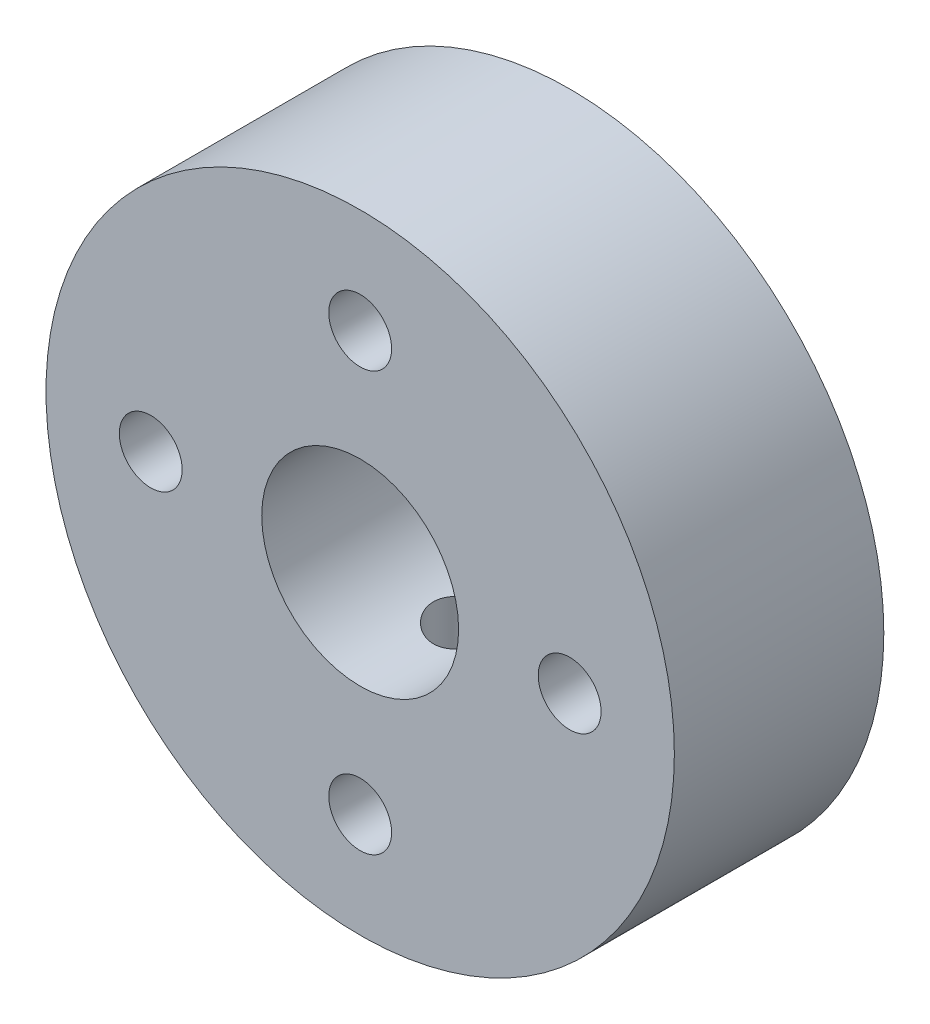
ISO-10303-21;
HEADER;
FILE_DESCRIPTION(('STEP AP214'),'2;1');
FILE_NAME('part.step','',(''),(''),'','','');
FILE_SCHEMA(('AUTOMOTIVE_DESIGN { 1 0 10303 214 1 1 1 1 }'));
ENDSEC;
DATA;
#1=APPLICATION_CONTEXT('core data for automotive mechanical design processes');
#2=APPLICATION_PROTOCOL_DEFINITION('international standard','automotive_design',2000,#1);
#3=PRODUCT_CONTEXT('',#1,'mechanical');
#4=PRODUCT('Part','Part','',(#3));
#5=PRODUCT_RELATED_PRODUCT_CATEGORY('part','',(#4));
#6=PRODUCT_DEFINITION_FORMATION('','',#4);
#7=PRODUCT_DEFINITION_CONTEXT('part definition',#1,'design');
#8=PRODUCT_DEFINITION('design','',#6,#7);
#9=PRODUCT_DEFINITION_SHAPE('','',#8);
#10=(LENGTH_UNIT() NAMED_UNIT(*) SI_UNIT(.MILLI.,.METRE.));
#11=(NAMED_UNIT(*) PLANE_ANGLE_UNIT() SI_UNIT($,.RADIAN.));
#12=(NAMED_UNIT(*) SI_UNIT($,.STERADIAN.) SOLID_ANGLE_UNIT());
#13=UNCERTAINTY_MEASURE_WITH_UNIT(LENGTH_MEASURE(1.E-05),#10,'distance_accuracy_value','');
#14=(GEOMETRIC_REPRESENTATION_CONTEXT(3) GLOBAL_UNCERTAINTY_ASSIGNED_CONTEXT((#13)) GLOBAL_UNIT_ASSIGNED_CONTEXT((#10,
#11,#12)) REPRESENTATION_CONTEXT('',''));
#15=CARTESIAN_POINT('',(0.,0.,0.));
#16=DIRECTION('',(0.,0.,1.));
#17=DIRECTION('',(1.,0.,0.));
#18=AXIS2_PLACEMENT_3D('',#15,#16,#17);
#19=CARTESIAN_POINT('',(2.8176792204172E-13,-10.,10.));
#20=DIRECTION('',(0.,0.,-1.));
#21=DIRECTION('',(-1.,0.,0.));
#22=AXIS2_PLACEMENT_3D('',#19,#20,#21);
#23=CYLINDRICAL_SURFACE('',#22,1.50000000000034);
#24=CARTESIAN_POINT('',(1.4088396102086E-13,-10.,5.));
#25=DIRECTION('',(0.,0.707106781186547,-0.707106781186547));
#26=DIRECTION('',(0.,-0.707106781186547,-0.707106781186547));
#27=AXIS2_PLACEMENT_3D('',#24,#25,#26);
#28=ELLIPSE('',#27,2.12132034355988,1.50000000000017);
#29=CARTESIAN_POINT('',(1.50000000000031,-10.,5.));
#30=VERTEX_POINT('',#29);
#31=CARTESIAN_POINT('',(-1.50000000000003,-10.,5.));
#32=VERTEX_POINT('',#31);
#33=EDGE_CURVE('E11',#30,#32,#28,.F.);
#34=ORIENTED_EDGE('',*,*,#33,.F.);
#35=CARTESIAN_POINT('',(1.4088396102086E-13,-10.,5.));
#36=DIRECTION('',(0.,-0.707106781186547,-0.707106781186547));
#37=DIRECTION('',(0.,0.707106781186547,-0.707106781186547));
#38=AXIS2_PLACEMENT_3D('',#35,#36,#37);
#39=ELLIPSE('',#38,2.12132034355988,1.50000000000017);
#40=EDGE_CURVE('E50',#32,#30,#39,.F.);
#41=ORIENTED_EDGE('',*,*,#40,.F.);
#42=EDGE_LOOP('',(#34,#41));
#43=FACE_BOUND('',#42,.T.);
#44=CARTESIAN_POINT('',(2.8176792204172E-13,-10.,10.));
#45=DIRECTION('',(0.,0.,1.));
#46=DIRECTION('',(1.,0.,0.));
#47=AXIS2_PLACEMENT_3D('',#44,#45,#46);
#48=CIRCLE('',#47,1.50000000000034);
#49=CARTESIAN_POINT('',(1.50000000000062,-10.,10.));
#50=VERTEX_POINT('',#49);
#51=EDGE_CURVE('E90',#50,#50,#48,.T.);
#52=ORIENTED_EDGE('',*,*,#51,.T.);
#53=EDGE_LOOP('',(#52));
#54=FACE_BOUND('',#53,.T.);
#55=ADVANCED_FACE('F35',(#43,#54),#23,.F.);
#56=CARTESIAN_POINT('',(0.,0.,10.));
#57=DIRECTION('',(0.,0.,1.));
#58=DIRECTION('',(1.,0.,0.));
#59=AXIS2_PLACEMENT_3D('',#56,#57,#58);
#60=PLANE('',#59);
#61=ORIENTED_EDGE('',*,*,#51,.F.);
#62=EDGE_LOOP('',(#61));
#63=FACE_BOUND('',#62,.T.);
#64=CARTESIAN_POINT('',(0.,0.,10.));
#65=DIRECTION('',(0.,0.,1.));
#66=DIRECTION('',(1.,0.,0.));
#67=AXIS2_PLACEMENT_3D('',#64,#65,#66);
#68=CIRCLE('',#67,4.7);
#69=CARTESIAN_POINT('',(4.7,0.,10.));
#70=VERTEX_POINT('',#69);
#71=EDGE_CURVE('E78',#70,#70,#68,.T.);
#72=ORIENTED_EDGE('',*,*,#71,.F.);
#73=EDGE_LOOP('',(#72));
#74=FACE_BOUND('',#73,.T.);
#75=CARTESIAN_POINT('',(0.,0.,10.));
#76=DIRECTION('',(0.,0.,1.));
#77=DIRECTION('',(1.,0.,0.));
#78=AXIS2_PLACEMENT_3D('',#75,#76,#77);
#79=CIRCLE('',#78,15.);
#80=CARTESIAN_POINT('',(15.,0.,10.));
#81=VERTEX_POINT('',#80);
#82=EDGE_CURVE('E63',#81,#81,#79,.T.);
#83=ORIENTED_EDGE('',*,*,#82,.T.);
#84=EDGE_LOOP('',(#83));
#85=FACE_BOUND('',#84,.T.);
#86=CARTESIAN_POINT('',(0.,10.,10.));
#87=DIRECTION('',(0.,0.,1.));
#88=DIRECTION('',(1.,0.,0.));
#89=AXIS2_PLACEMENT_3D('',#86,#87,#88);
#90=CIRCLE('',#89,1.5);
#91=CARTESIAN_POINT('',(1.5,10.,10.));
#92=VERTEX_POINT('',#91);
#93=EDGE_CURVE('E72',#92,#92,#90,.T.);
#94=ORIENTED_EDGE('',*,*,#93,.F.);
#95=EDGE_LOOP('',(#94));
#96=FACE_BOUND('',#95,.T.);
#97=CARTESIAN_POINT('',(10.,0.,10.));
#98=DIRECTION('',(0.,0.,1.));
#99=DIRECTION('',(1.,0.,0.));
#100=AXIS2_PLACEMENT_3D('',#97,#98,#99);
#101=CIRCLE('',#100,1.5);
#102=CARTESIAN_POINT('',(11.5,0.,10.));
#103=VERTEX_POINT('',#102);
#104=EDGE_CURVE('E84',#103,#103,#101,.T.);
#105=ORIENTED_EDGE('',*,*,#104,.F.);
#106=EDGE_LOOP('',(#105));
#107=FACE_BOUND('',#106,.T.);
#108=CARTESIAN_POINT('',(-9.99999999999986,-1.39659314221713E-13,10.));
#109=DIRECTION('',(0.,0.,1.));
#110=DIRECTION('',(1.,0.,0.));
#111=AXIS2_PLACEMENT_3D('',#108,#109,#110);
#112=CIRCLE('',#111,1.50000000000027);
#113=CARTESIAN_POINT('',(-8.49999999999959,-1.39659314221713E-13,10.));
#114=VERTEX_POINT('',#113);
#115=EDGE_CURVE('E96',#114,#114,#112,.T.);
#116=ORIENTED_EDGE('',*,*,#115,.F.);
#117=EDGE_LOOP('',(#116));
#118=FACE_BOUND('',#117,.T.);
#119=ADVANCED_FACE('F137',(#63,#74,#85,#96,#107,#118),#60,.T.);
#120=CARTESIAN_POINT('',(0.,0.,0.));
#121=DIRECTION('',(0.,0.,1.));
#122=DIRECTION('',(1.,0.,0.));
#123=AXIS2_PLACEMENT_3D('',#120,#121,#122);
#124=PLANE('',#123);
#125=CARTESIAN_POINT('',(2.8176792204172E-13,-10.,0.));
#126=DIRECTION('',(0.,0.,1.));
#127=DIRECTION('',(1.,0.,0.));
#128=AXIS2_PLACEMENT_3D('',#125,#126,#127);
#129=CIRCLE('',#128,1.50000000000034);
#130=CARTESIAN_POINT('',(1.50000000000062,-10.,0.));
#131=VERTEX_POINT('',#130);
#132=EDGE_CURVE('E93',#131,#131,#129,.T.);
#133=ORIENTED_EDGE('',*,*,#132,.T.);
#134=EDGE_LOOP('',(#133));
#135=FACE_BOUND('',#134,.T.);
#136=CARTESIAN_POINT('',(0.,0.,0.));
#137=DIRECTION('',(0.,0.,1.));
#138=DIRECTION('',(1.,0.,0.));
#139=AXIS2_PLACEMENT_3D('',#136,#137,#138);
#140=CIRCLE('',#139,4.7);
#141=CARTESIAN_POINT('',(4.7,0.,0.));
#142=VERTEX_POINT('',#141);
#143=EDGE_CURVE('E81',#142,#142,#140,.T.);
#144=ORIENTED_EDGE('',*,*,#143,.T.);
#145=EDGE_LOOP('',(#144));
#146=FACE_BOUND('',#145,.T.);
#147=CARTESIAN_POINT('',(0.,0.,0.));
#148=DIRECTION('',(0.,0.,1.));
#149=DIRECTION('',(1.,0.,0.));
#150=AXIS2_PLACEMENT_3D('',#147,#148,#149);
#151=CIRCLE('',#150,15.);
#152=CARTESIAN_POINT('',(15.,0.,0.));
#153=VERTEX_POINT('',#152);
#154=EDGE_CURVE('E69',#153,#153,#151,.T.);
#155=ORIENTED_EDGE('',*,*,#154,.F.);
#156=EDGE_LOOP('',(#155));
#157=FACE_BOUND('',#156,.T.);
#158=CARTESIAN_POINT('',(0.,10.,0.));
#159=DIRECTION('',(0.,0.,1.));
#160=DIRECTION('',(1.,0.,0.));
#161=AXIS2_PLACEMENT_3D('',#158,#159,#160);
#162=CIRCLE('',#161,1.5);
#163=CARTESIAN_POINT('',(1.5,10.,0.));
#164=VERTEX_POINT('',#163);
#165=EDGE_CURVE('E75',#164,#164,#162,.T.);
#166=ORIENTED_EDGE('',*,*,#165,.T.);
#167=EDGE_LOOP('',(#166));
#168=FACE_BOUND('',#167,.T.);
#169=CARTESIAN_POINT('',(10.,0.,0.));
#170=DIRECTION('',(0.,0.,1.));
#171=DIRECTION('',(1.,0.,0.));
#172=AXIS2_PLACEMENT_3D('',#169,#170,#171);
#173=CIRCLE('',#172,1.5);
#174=CARTESIAN_POINT('',(11.5,0.,0.));
#175=VERTEX_POINT('',#174);
#176=EDGE_CURVE('E87',#175,#175,#173,.T.);
#177=ORIENTED_EDGE('',*,*,#176,.T.);
#178=EDGE_LOOP('',(#177));
#179=FACE_BOUND('',#178,.T.);
#180=CARTESIAN_POINT('',(-9.99999999999986,-1.39659314221713E-13,0.));
#181=DIRECTION('',(0.,0.,1.));
#182=DIRECTION('',(1.,0.,0.));
#183=AXIS2_PLACEMENT_3D('',#180,#181,#182);
#184=CIRCLE('',#183,1.50000000000027);
#185=CARTESIAN_POINT('',(-8.49999999999959,-1.39659314221713E-13,0.));
#186=VERTEX_POINT('',#185);
#187=EDGE_CURVE('E99',#186,#186,#184,.T.);
#188=ORIENTED_EDGE('',*,*,#187,.T.);
#189=EDGE_LOOP('',(#188));
#190=FACE_BOUND('',#189,.T.);
#191=ADVANCED_FACE('F139',(#135,#146,#157,#168,#179,#190),#124,.F.);
#192=CARTESIAN_POINT('',(0.,0.,10.));
#193=DIRECTION('',(0.,0.,-1.));
#194=DIRECTION('',(-1.,0.,0.));
#195=AXIS2_PLACEMENT_3D('',#192,#193,#194);
#196=CYLINDRICAL_SURFACE('',#195,15.);
#197=CARTESIAN_POINT('',(0.,-15.,6.5));
#198=CARTESIAN_POINT('',(0.0840305306873358,-14.9999990328115,6.49999636114943));
#199=CARTESIAN_POINT('',(0.16811661775166,-14.9992863839431,6.49291509665533));
#200=CARTESIAN_POINT('',(0.333957597745255,-14.9965120139211,6.46477344456436));
#201=CARTESIAN_POINT('',(0.415709818753242,-14.9944488065104,6.44369765596312));
#202=CARTESIAN_POINT('',(0.574457513180122,-14.9892062184461,6.38818663910325));
#203=CARTESIAN_POINT('',(0.651455826922364,-14.9860275120106,6.35375947922229));
#204=CARTESIAN_POINT('',(0.79856424144061,-14.9789093609146,6.27253863810253));
#205=CARTESIAN_POINT('',(0.868675708168615,-14.974970067572,6.22574741599979));
#206=CARTESIAN_POINT('',(1.00028932601112,-14.9667561651199,6.12094595350659));
#207=CARTESIAN_POINT('',(1.06176321725234,-14.962480523608,6.06290030089695));
#208=CARTESIAN_POINT('',(1.17411378214648,-14.9540843535939,5.93731319860545));
#209=CARTESIAN_POINT('',(1.22498996562398,-14.9499638322738,5.86977130993642));
#210=CARTESIAN_POINT('',(1.31480095566542,-14.9423338732918,5.72693220247457));
#211=CARTESIAN_POINT('',(1.35371019818232,-14.9388257506636,5.65161883385771));
#212=CARTESIAN_POINT('',(1.41831957711414,-14.9328305631979,5.49548662114253));
#213=CARTESIAN_POINT('',(1.44402003988694,-14.9303434731333,5.41466791312408));
#214=CARTESIAN_POINT('',(1.48139856240284,-14.9266812610947,5.25010729870099));
#215=CARTESIAN_POINT('',(1.49312347950569,-14.9255017559714,5.16637613472169));
#216=CARTESIAN_POINT('',(1.50236292770304,-14.9245746459079,4.99812670490633));
#217=CARTESIAN_POINT('',(1.4998778323062,-14.9248270033312,4.91360845981691));
#218=CARTESIAN_POINT('',(1.48080642037902,-14.926731103484,4.74650703546002));
#219=CARTESIAN_POINT('',(1.46427126618683,-14.9283777688598,4.66391795100696));
#220=CARTESIAN_POINT('',(1.41764871622588,-14.9328770143113,4.50269305519836));
#221=CARTESIAN_POINT('',(1.38756113738362,-14.9357296106774,4.42405729726245));
#222=CARTESIAN_POINT('',(1.31463134082226,-14.9423251417811,4.27280961905167));
#223=CARTESIAN_POINT('',(1.27176642407997,-14.9460696586224,4.20020871576603));
#224=CARTESIAN_POINT('',(1.17451504102984,-14.9540257759932,4.06321217763218));
#225=CARTESIAN_POINT('',(1.12012823750476,-14.9582373901918,3.99881678302736));
#226=CARTESIAN_POINT('',(1.0010911686181,-14.9666757796948,3.87976190901646));
#227=CARTESIAN_POINT('',(0.936396718277045,-14.970902539995,3.82514659717879));
#228=CARTESIAN_POINT('',(0.798734222605669,-14.9788774361778,3.72754455063442));
#229=CARTESIAN_POINT('',(0.725766167999401,-14.9826255715238,3.68455782896529));
#230=CARTESIAN_POINT('',(0.573597158538547,-14.9892221350064,3.61143496953462));
#231=CARTESIAN_POINT('',(0.494395119584855,-14.9920704062215,3.58130107277291));
#232=CARTESIAN_POINT('',(0.332020825994899,-14.9965447116211,3.53477162493237));
#233=CARTESIAN_POINT('',(0.248848690164901,-14.9981707823559,3.51837566301407));
#234=CARTESIAN_POINT('',(0.0812776486378563,-15.0000127750247,3.49984353839785));
#235=CARTESIAN_POINT('',(-0.00311445315823709,-15.000234724016,3.49764642762125));
#236=CARTESIAN_POINT('',(-0.171065689973549,-14.999259626352,3.50741429457315));
#237=CARTESIAN_POINT('',(-0.254624836230704,-14.998062598867,3.51937908097292));
#238=CARTESIAN_POINT('',(-0.418362310252011,-14.9943879230879,3.55708054313236));
#239=CARTESIAN_POINT('',(-0.498547273458028,-14.9919129287706,3.58278868171702));
#240=CARTESIAN_POINT('',(-0.653466482075672,-14.9859599829091,3.64721776105591));
#241=CARTESIAN_POINT('',(-0.728200605235675,-14.9824820088788,3.6859389935591));
#242=CARTESIAN_POINT('',(-0.870372270258213,-14.9748971299563,3.77544625799587));
#243=CARTESIAN_POINT('',(-0.937784489623376,-14.9707881540516,3.82627233338873));
#244=CARTESIAN_POINT('',(-1.06314243496782,-14.9624089930428,3.93848910161139));
#245=CARTESIAN_POINT('',(-1.12108792327377,-14.9581388038946,3.99988005960547));
#246=CARTESIAN_POINT('',(-1.22607916483072,-14.9499003621113,4.1317498619885));
#247=CARTESIAN_POINT('',(-1.27308491801931,-14.9459332520846,4.20226063481393));
#248=CARTESIAN_POINT('',(-1.35458738811574,-14.9387674869133,4.35021104022003));
#249=CARTESIAN_POINT('',(-1.38908427608082,-14.9355688212606,4.42765057803259));
#250=CARTESIAN_POINT('',(-1.44452281302671,-14.9303092145107,4.58712310919869));
#251=CARTESIAN_POINT('',(-1.46548826221779,-14.9282462767468,4.66914776013668));
#252=CARTESIAN_POINT('',(-1.49334601069419,-14.9254854792431,4.83557479694116));
#253=CARTESIAN_POINT('',(-1.50023871359928,-14.9247875803528,4.91997711454351));
#254=CARTESIAN_POINT('',(-1.49974970770688,-14.9248366966134,5.08836603253506));
#255=CARTESIAN_POINT('',(-1.49243083438967,-14.9255773513051,5.17235282432422));
#256=CARTESIAN_POINT('',(-1.46385817944548,-14.9284065583432,5.33789737575243));
#257=CARTESIAN_POINT('',(-1.44260438214324,-14.9304951122058,5.41945513265897));
#258=CARTESIAN_POINT('',(-1.38678252944625,-14.9357830239478,5.57782602357179));
#259=CARTESIAN_POINT('',(-1.35221631651137,-14.9389822281054,5.65463981244459));
#260=CARTESIAN_POINT('',(-1.27075733236657,-14.9461312775904,5.80138533750655));
#261=CARTESIAN_POINT('',(-1.22386463018312,-14.9500811187143,5.87131711223094));
#262=CARTESIAN_POINT('',(-1.118847834428,-14.9583073081455,6.0026355117079));
#263=CARTESIAN_POINT('',(-1.0606769233354,-14.9625849709013,6.06398461455063));
#264=CARTESIAN_POINT('',(-0.934847548837664,-14.9709728209317,6.17607834904949));
#265=CARTESIAN_POINT('',(-0.867186816162385,-14.9750829678446,6.22682043703576));
#266=CARTESIAN_POINT('',(-0.724112151241934,-14.9826834310374,6.31636018078193));
#267=CARTESIAN_POINT('',(-0.648679124020146,-14.9861721604022,6.35512743641777));
#268=CARTESIAN_POINT('',(-0.492387418650827,-14.9921194387484,6.4193936342358));
#269=CARTESIAN_POINT('',(-0.411534974738415,-14.9945791486448,6.44490753643032));
#270=CARTESIAN_POINT('',(-0.275187392108557,-14.997573206606,6.4755809256272));
#271=CARTESIAN_POINT('',(-0.220563829266763,-14.9984790103775,6.48472556644904));
#272=CARTESIAN_POINT('',(-0.110634871225969,-14.9996927242618,6.49693628909264));
#273=CARTESIAN_POINT('',(-0.0553294788398368,-15.0000006368404,6.50000239598279));
#274=CARTESIAN_POINT('',(0.,-15.,6.5));
#275=B_SPLINE_CURVE_WITH_KNOTS('',3,(#197,#198,#199,#200,#201,#202,#203,#204,#205,#206,#207,
#208,#209,#210,#211,#212,#213,#214,#215,#216,#217,#218,#219,#220,#221,#222,#223,#224,#225,#226,
#227,#228,#229,#230,#231,#232,#233,#234,#235,#236,#237,#238,#239,#240,#241,#242,#243,#244,#245,
#246,#247,#248,#249,#250,#251,#252,#253,#254,#255,#256,#257,#258,#259,#260,#261,#262,#263,#264,
#265,#266,#267,#268,#269,#270,#271,#272,#273,#274),.UNSPECIFIED.,.T.,.F.,(4,2,2,2,2,2,2,2,2,2,2,
2,2,2,2,2,2,2,2,2,2,2,2,2,2,2,2,2,2,2,2,2,2,2,2,2,2,2,4),(0.,0.25188954940271,0.50405676425323,
0.756071828598304,1.00803680637417,1.26080785293442,1.51359058831059,1.76690963208333,
2.02022241663756,2.27268348067795,2.52513790883665,2.77667696161666,3.02821941242451,
3.28021142059342,3.53221080496688,3.7853210129431,4.03843150469658,4.29158611040372,
4.54473314513159,4.79679282911636,5.04884910778715,5.30038402941457,5.551924590742,
5.80430911123048,6.05669996715345,6.30999965412898,6.56329587713061,6.81614535889505,
7.06898758859378,7.32071443940935,7.57244157339059,7.824133880442,8.0758247780844,
8.3285837614148,8.58140328955437,8.83485946539363,9.08802892192942,9.25388500848523,
9.41974041103541),.UNSPECIFIED.);
#276=CARTESIAN_POINT('',(0.,-15.,6.5));
#277=VERTEX_POINT('',#276);
#278=EDGE_CURVE('E102',#277,#277,#275,.T.);
#279=ORIENTED_EDGE('',*,*,#278,.T.);
#280=EDGE_LOOP('',(#279));
#281=FACE_BOUND('',#280,.T.);
#282=ORIENTED_EDGE('',*,*,#82,.F.);
#283=EDGE_LOOP('',(#282));
#284=FACE_BOUND('',#283,.T.);
#285=ORIENTED_EDGE('',*,*,#154,.T.);
#286=EDGE_LOOP('',(#285));
#287=FACE_BOUND('',#286,.T.);
#288=ADVANCED_FACE('F37',(#281,#284,#287),#196,.T.);
#289=CARTESIAN_POINT('',(0.,10.,10.));
#290=DIRECTION('',(0.,0.,-1.));
#291=DIRECTION('',(-1.,0.,0.));
#292=AXIS2_PLACEMENT_3D('',#289,#290,#291);
#293=CYLINDRICAL_SURFACE('',#292,1.5);
#294=ORIENTED_EDGE('',*,*,#93,.T.);
#295=EDGE_LOOP('',(#294));
#296=FACE_BOUND('',#295,.T.);
#297=ORIENTED_EDGE('',*,*,#165,.F.);
#298=EDGE_LOOP('',(#297));
#299=FACE_BOUND('',#298,.T.);
#300=ADVANCED_FACE('F132',(#296,#299),#293,.F.);
#301=CARTESIAN_POINT('',(0.,0.,10.));
#302=DIRECTION('',(0.,0.,-1.));
#303=DIRECTION('',(-1.,0.,0.));
#304=AXIS2_PLACEMENT_3D('',#301,#302,#303);
#305=CYLINDRICAL_SURFACE('',#304,4.7);
#306=CARTESIAN_POINT('',(0.,-4.7,6.5));
#307=CARTESIAN_POINT('',(0.0820387352449153,-4.6999997740306,6.49999973546752));
#308=CARTESIAN_POINT('',(0.164080625454089,-4.69783188418176,6.4932475515479));
#309=CARTESIAN_POINT('',(0.325759704645704,-4.68939648492743,6.4664917025185));
#310=CARTESIAN_POINT('',(0.405396439696572,-4.68312820664045,6.44648555209136));
#311=CARTESIAN_POINT('',(0.559910618207905,-4.66717565370787,6.39396904082166));
#312=CARTESIAN_POINT('',(0.634795395944523,-4.6574968021994,6.36147852393827));
#313=CARTESIAN_POINT('',(0.778053745663056,-4.6357188579504,6.28500164871687));
#314=CARTESIAN_POINT('',(0.846426205162673,-4.62361935278656,6.24101333102801));
#315=CARTESIAN_POINT('',(0.976911746880739,-4.59784704646632,6.14130574482553));
#316=CARTESIAN_POINT('',(1.03878683335699,-4.58413888316472,6.08528419637578));
#317=CARTESIAN_POINT('',(1.15244220084626,-4.55689581333198,5.96374370006823));
#318=CARTESIAN_POINT('',(1.2042204987706,-4.54336094132338,5.89822289087792));
#319=CARTESIAN_POINT('',(1.29752410172767,-4.51761449436775,5.75745778172429));
#320=CARTESIAN_POINT('',(1.33874833303293,-4.50544639545833,5.68200521020244));
#321=CARTESIAN_POINT('',(1.40782271455815,-4.48434489725741,5.52478701855501));
#322=CARTESIAN_POINT('',(1.43567656064548,-4.47541060423927,5.44302315027261));
#323=CARTESIAN_POINT('',(1.47634175404284,-4.46215894810033,5.27819570734242));
#324=CARTESIAN_POINT('',(1.48959601787267,-4.45770601877757,5.19525261505984));
#325=CARTESIAN_POINT('',(1.50206984654175,-4.45351922545464,5.02820959207917));
#326=CARTESIAN_POINT('',(1.50129332809182,-4.4537840444887,4.94410999077217));
#327=CARTESIAN_POINT('',(1.48607326028523,-4.45888343196458,4.78083992864143));
#328=CARTESIAN_POINT('',(1.47219734451101,-4.46352819584728,4.70160961709577));
#329=CARTESIAN_POINT('',(1.43209447658703,-4.47655508298902,4.54666635218997));
#330=CARTESIAN_POINT('',(1.40586616020979,-4.48493761905075,4.47095378835294));
#331=CARTESIAN_POINT('',(1.34141142124528,-4.50463778534354,4.32386266095041));
#332=CARTESIAN_POINT('',(1.30300992789178,-4.51599779539822,4.25256673293657));
#333=CARTESIAN_POINT('',(1.2154204696868,-4.5403540269843,4.11724667206498));
#334=CARTESIAN_POINT('',(1.16622960266184,-4.55335068834808,4.05322450278199));
#335=CARTESIAN_POINT('',(1.05569084659379,-4.58027268176949,3.93106618873404));
#336=CARTESIAN_POINT('',(0.993875749683399,-4.59421277171903,3.87335525888061));
#337=CARTESIAN_POINT('',(0.861271893187019,-4.62090671868608,3.76901304316751));
#338=CARTESIAN_POINT('',(0.79048241111541,-4.63366048005436,3.72238265021957));
#339=CARTESIAN_POINT('',(0.641094093836545,-4.65668875875591,3.64122034463094));
#340=CARTESIAN_POINT('',(0.562434448699687,-4.66694146656905,3.60679375101852));
#341=CARTESIAN_POINT('',(0.400036368047701,-4.6836547676851,3.55178936115137));
#342=CARTESIAN_POINT('',(0.316299553023868,-4.69011656398475,3.53120717124999));
#343=CARTESIAN_POINT('',(0.149730442092448,-4.69832460277312,3.50520921390194));
#344=CARTESIAN_POINT('',(0.0669966191043717,-4.70024961657484,3.49921814954883));
#345=CARTESIAN_POINT('',(-0.0983052531413304,-4.69969824340963,3.50094522654511));
#346=CARTESIAN_POINT('',(-0.180873325839389,-4.69722253024336,3.50866126918256));
#347=CARTESIAN_POINT('',(-0.34125478260782,-4.68826554172148,3.53712365643985));
#348=CARTESIAN_POINT('',(-0.419136029253703,-4.68189060453463,3.55752430788772));
#349=CARTESIAN_POINT('',(-0.570345658878661,-4.66588592204873,3.61035175600521));
#350=CARTESIAN_POINT('',(-0.643673471464911,-4.65625576994992,3.64278005580292));
#351=CARTESIAN_POINT('',(-0.785736375187927,-4.63442724397213,3.71964690860909));
#352=CARTESIAN_POINT('',(-0.854310685902183,-4.62217064992318,3.76436561689961));
#353=CARTESIAN_POINT('',(-0.983173050751879,-4.59648725250652,3.86421001795906));
#354=CARTESIAN_POINT('',(-1.04345875842826,-4.58306011951622,3.91933864728058));
#355=CARTESIAN_POINT('',(-1.15662803115739,-4.55584704068879,4.04114441163544));
#356=CARTESIAN_POINT('',(-1.20910131984075,-4.54206928398347,4.10820544835284));
#357=CARTESIAN_POINT('',(-1.30209081425484,-4.51629227130194,4.25047981471178));
#358=CARTESIAN_POINT('',(-1.3426071295547,-4.50429299902888,4.32569306964088));
#359=CARTESIAN_POINT('',(-1.41029808653301,-4.48356062861829,4.48203474059575));
#360=CARTESIAN_POINT('',(-1.43751754392792,-4.47481658311487,4.56314221377547));
#361=CARTESIAN_POINT('',(-1.47780723081082,-4.46167497960727,4.72912799112414));
#362=CARTESIAN_POINT('',(-1.49088314675221,-4.45727567484892,4.81400476553446));
#363=CARTESIAN_POINT('',(-1.5020948756433,-4.45350896274241,4.98081579185478));
#364=CARTESIAN_POINT('',(-1.50090615933961,-4.45391404313993,5.06270005003916));
#365=CARTESIAN_POINT('',(-1.48526293722667,-4.45915468355963,5.22503963576151));
#366=CARTESIAN_POINT('',(-1.47080910114426,-4.46399001990786,5.30549503523038));
#367=CARTESIAN_POINT('',(-1.42950649365558,-4.47738402480638,5.46142804845393));
#368=CARTESIAN_POINT('',(-1.40285894209482,-4.48588212327865,5.5369645604773));
#369=CARTESIAN_POINT('',(-1.33808505908533,-4.50562642559741,5.68255419041034));
#370=CARTESIAN_POINT('',(-1.29995632229468,-4.51687320520755,5.75260615541266));
#371=CARTESIAN_POINT('',(-1.21149489244577,-4.54141667984595,5.88831528003353));
#372=CARTESIAN_POINT('',(-1.16072991488722,-4.55477801947807,5.95367892284344));
#373=CARTESIAN_POINT('',(-1.0491882793588,-4.58175642045649,6.07517828655666));
#374=CARTESIAN_POINT('',(-0.988408897105936,-4.59537355049156,6.13131148811847));
#375=CARTESIAN_POINT('',(-0.856036162994094,-4.62189432992767,6.23470423547356));
#376=CARTESIAN_POINT('',(-0.784141516585037,-4.63475701760686,6.28158975725755));
#377=CARTESIAN_POINT('',(-0.633081920204615,-4.65779256481327,6.36255050646602));
#378=CARTESIAN_POINT('',(-0.553919535030144,-4.66796636837323,6.39663023161857));
#379=CARTESIAN_POINT('',(-0.396463315046063,-4.68386806367302,6.44885930777386));
#380=CARTESIAN_POINT('',(-0.318518254690136,-4.6898635837034,6.46797995134136));
#381=CARTESIAN_POINT('',(-0.160382796819612,-4.69792922321596,6.49354900922903));
#382=CARTESIAN_POINT('',(-0.0801929057054186,-4.7000002208852,6.50000025858064));
#383=CARTESIAN_POINT('',(0.,-4.7,6.5));
#384=B_SPLINE_CURVE_WITH_KNOTS('',3,(#306,#307,#308,#309,#310,#311,#312,#313,#314,#315,#316,
#317,#318,#319,#320,#321,#322,#323,#324,#325,#326,#327,#328,#329,#330,#331,#332,#333,#334,#335,
#336,#337,#338,#339,#340,#341,#342,#343,#344,#345,#346,#347,#348,#349,#350,#351,#352,#353,#354,
#355,#356,#357,#358,#359,#360,#361,#362,#363,#364,#365,#366,#367,#368,#369,#370,#371,#372,#373,
#374,#375,#376,#377,#378,#379,#380,#381,#382,#383),.UNSPECIFIED.,.T.,.F.,(4,2,2,2,2,2,2,2,2,2,2,
2,2,2,2,2,2,2,2,2,2,2,2,2,2,2,2,2,2,2,2,2,2,2,2,2,2,2,4),(0.,0.245821335418204,
0.491688779072401,0.737167021197529,0.982687122800597,1.23530262013734,1.4879676832807,
1.74719215635075,2.00634493277552,2.25739841624762,2.50838181890186,2.74896559661384,
2.98957595118386,3.23381693873547,3.47812370405264,3.73405908955262,3.99001509230877,
4.2481291032379,4.50616116065518,4.75384193748683,5.00148479487975,5.24265779434874,
5.48386094402787,5.73109804159225,5.9784049871684,6.23596042282266,6.49351349826419,
6.75019242293323,7.00676811066516,7.25124411604647,7.49570777904869,7.73627522192756,
7.97689309949719,8.22727091719206,8.47771695957487,8.7368244123951,8.99584077470184,
9.23618504392167,9.47647552515253),.UNSPECIFIED.);
#385=CARTESIAN_POINT('',(0.,-4.7,6.5));
#386=VERTEX_POINT('',#385);
#387=EDGE_CURVE('E110',#386,#386,#384,.T.);
#388=ORIENTED_EDGE('',*,*,#387,.F.);
#389=EDGE_LOOP('',(#388));
#390=FACE_BOUND('',#389,.T.);
#391=ORIENTED_EDGE('',*,*,#71,.T.);
#392=EDGE_LOOP('',(#391));
#393=FACE_BOUND('',#392,.T.);
#394=ORIENTED_EDGE('',*,*,#143,.F.);
#395=EDGE_LOOP('',(#394));
#396=FACE_BOUND('',#395,.T.);
#397=ADVANCED_FACE('F127',(#390,#393,#396),#305,.F.);
#398=CARTESIAN_POINT('',(10.,0.,10.));
#399=DIRECTION('',(0.,0.,-1.));
#400=DIRECTION('',(-1.,0.,0.));
#401=AXIS2_PLACEMENT_3D('',#398,#399,#400);
#402=CYLINDRICAL_SURFACE('',#401,1.5);
#403=ORIENTED_EDGE('',*,*,#104,.T.);
#404=EDGE_LOOP('',(#403));
#405=FACE_BOUND('',#404,.T.);
#406=ORIENTED_EDGE('',*,*,#176,.F.);
#407=EDGE_LOOP('',(#406));
#408=FACE_BOUND('',#407,.T.);
#409=ADVANCED_FACE('F125',(#405,#408),#402,.F.);
#410=CARTESIAN_POINT('',(1.4088396102086E-13,-10.,5.));
#411=DIRECTION('',(0.,0.707106781186547,-0.707106781186547));
#412=DIRECTION('',(0.,-0.707106781186547,-0.707106781186547));
#413=AXIS2_PLACEMENT_3D('',#410,#411,#412);
#414=ELLIPSE('',#413,2.12132034355988,1.50000000000017);
#415=EDGE_CURVE('E44',#30,#32,#414,.T.);
#416=ORIENTED_EDGE('',*,*,#415,.F.);
#417=CARTESIAN_POINT('',(1.4088396102086E-13,-10.,5.));
#418=DIRECTION('',(0.,-0.707106781186547,-0.707106781186547));
#419=DIRECTION('',(0.,0.707106781186547,-0.707106781186547));
#420=AXIS2_PLACEMENT_3D('',#417,#418,#419);
#421=ELLIPSE('',#420,2.12132034355988,1.50000000000017);
#422=EDGE_CURVE('E55',#32,#30,#421,.T.);
#423=ORIENTED_EDGE('',*,*,#422,.F.);
#424=EDGE_LOOP('',(#416,#423));
#425=FACE_BOUND('',#424,.T.);
#426=ORIENTED_EDGE('',*,*,#132,.F.);
#427=EDGE_LOOP('',(#426));
#428=FACE_BOUND('',#427,.T.);
#429=ADVANCED_FACE('F66',(#425,#428),#23,.F.);
#430=CARTESIAN_POINT('',(-9.99999999999986,-1.39659314221713E-13,10.));
#431=DIRECTION('',(0.,0.,-1.));
#432=DIRECTION('',(-1.,0.,0.));
#433=AXIS2_PLACEMENT_3D('',#430,#431,#432);
#434=CYLINDRICAL_SURFACE('',#433,1.50000000000027);
#435=ORIENTED_EDGE('',*,*,#115,.T.);
#436=EDGE_LOOP('',(#435));
#437=FACE_BOUND('',#436,.T.);
#438=ORIENTED_EDGE('',*,*,#187,.F.);
#439=EDGE_LOOP('',(#438));
#440=FACE_BOUND('',#439,.T.);
#441=ADVANCED_FACE('F118',(#437,#440),#434,.F.);
#442=CARTESIAN_POINT('',(0.,-35.,5.));
#443=DIRECTION('',(0.,1.,0.));
#444=DIRECTION('',(0.,0.,1.));
#445=AXIS2_PLACEMENT_3D('',#442,#443,#444);
#446=CYLINDRICAL_SURFACE('',#445,1.5);
#447=ORIENTED_EDGE('',*,*,#415,.T.);
#448=ORIENTED_EDGE('',*,*,#40,.T.);
#449=EDGE_LOOP('',(#447,#448));
#450=FACE_BOUND('',#449,.T.);
#451=ORIENTED_EDGE('',*,*,#278,.F.);
#452=EDGE_LOOP('',(#451));
#453=FACE_BOUND('',#452,.T.);
#454=ADVANCED_FACE('F61',(#450,#453),#446,.F.);
#455=ORIENTED_EDGE('',*,*,#387,.T.);
#456=EDGE_LOOP('',(#455));
#457=FACE_BOUND('',#456,.T.);
#458=ORIENTED_EDGE('',*,*,#33,.T.);
#459=ORIENTED_EDGE('',*,*,#422,.T.);
#460=EDGE_LOOP('',(#458,#459));
#461=FACE_BOUND('',#460,.T.);
#462=ADVANCED_FACE('F56',(#457,#461),#446,.F.);
#463=CLOSED_SHELL('',(#55,#119,#191,#288,#300,#397,#409,#429,#441,#454,#462));
#464=MANIFOLD_SOLID_BREP('B2',#463);
#465=ADVANCED_BREP_SHAPE_REPRESENTATION('',(#18,#464),#14);
#466=SHAPE_DEFINITION_REPRESENTATION(#9,#465);
ENDSEC;
END-ISO-10303-21;
